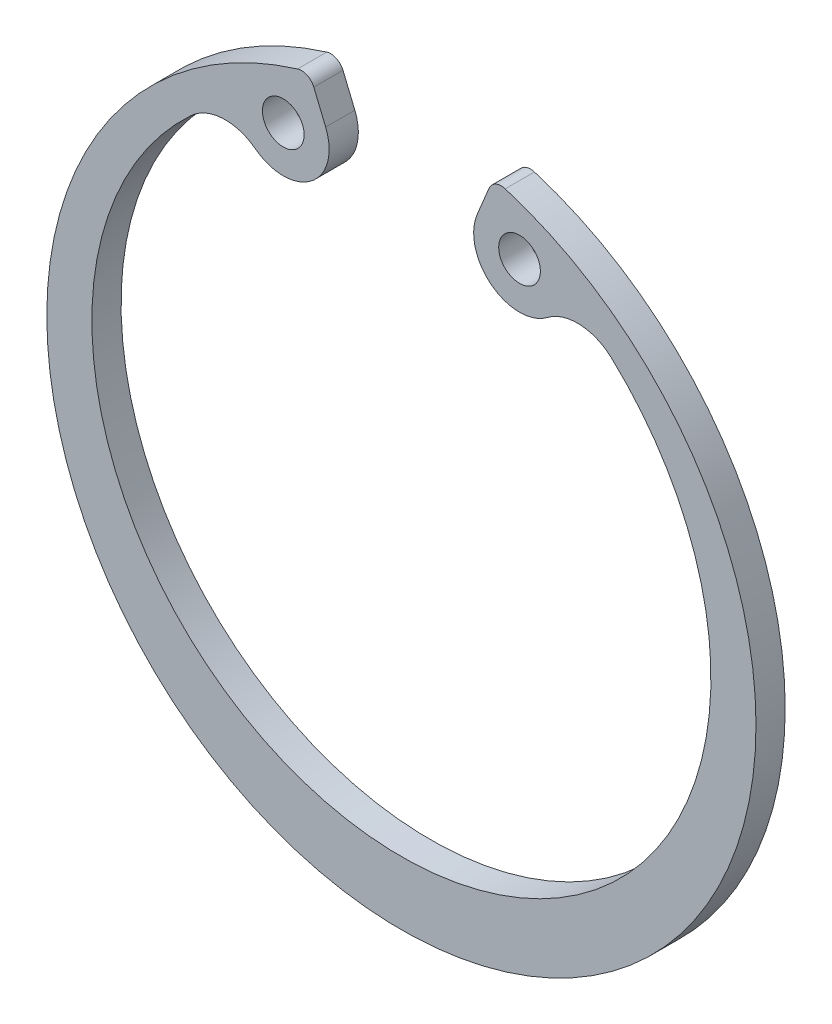
ISO-10303-21;
HEADER;
FILE_DESCRIPTION(('STEP AP214'),'2;1');
FILE_NAME('part.step','',(''),(''),'','','');
FILE_SCHEMA(('AUTOMOTIVE_DESIGN { 1 0 10303 214 1 1 1 1 }'));
ENDSEC;
DATA;
#1=APPLICATION_CONTEXT('core data for automotive mechanical design processes');
#2=APPLICATION_PROTOCOL_DEFINITION('international standard','automotive_design',2000,#1);
#3=PRODUCT_CONTEXT('',#1,'mechanical');
#4=PRODUCT('Part','Part','',(#3));
#5=PRODUCT_RELATED_PRODUCT_CATEGORY('part','',(#4));
#6=PRODUCT_DEFINITION_FORMATION('','',#4);
#7=PRODUCT_DEFINITION_CONTEXT('part definition',#1,'design');
#8=PRODUCT_DEFINITION('design','',#6,#7);
#9=PRODUCT_DEFINITION_SHAPE('','',#8);
#10=(LENGTH_UNIT() NAMED_UNIT(*) SI_UNIT(.MILLI.,.METRE.));
#11=(NAMED_UNIT(*) PLANE_ANGLE_UNIT() SI_UNIT($,.RADIAN.));
#12=(NAMED_UNIT(*) SI_UNIT($,.STERADIAN.) SOLID_ANGLE_UNIT());
#13=UNCERTAINTY_MEASURE_WITH_UNIT(LENGTH_MEASURE(1.E-05),#10,'distance_accuracy_value','');
#14=(GEOMETRIC_REPRESENTATION_CONTEXT(3) GLOBAL_UNCERTAINTY_ASSIGNED_CONTEXT((#13)) GLOBAL_UNIT_ASSIGNED_CONTEXT((#10,
#11,#12)) REPRESENTATION_CONTEXT('',''));
#15=CARTESIAN_POINT('',(0.,0.,0.));
#16=DIRECTION('',(0.,0.,1.));
#17=DIRECTION('',(1.,0.,0.));
#18=AXIS2_PLACEMENT_3D('',#15,#16,#17);
#19=CARTESIAN_POINT('',(-5.98848736185956,19.5535295820691,0.));
#20=DIRECTION('',(0.,0.,1.));
#21=DIRECTION('',(1.,0.,0.));
#22=AXIS2_PLACEMENT_3D('',#19,#20,#21);
#23=CYLINDRICAL_SURFACE('',#22,0.799999999999982);
#24=CARTESIAN_POINT('',(-5.98848736185956,19.5535295820691,1.75));
#25=DIRECTION('',(0.,0.,1.));
#26=DIRECTION('',(1.,0.,0.));
#27=AXIS2_PLACEMENT_3D('',#24,#25,#26);
#28=CIRCLE('',#27,0.799999999999982);
#29=CARTESIAN_POINT('',(-5.24938116554028,19.8596701226096,1.75));
#30=VERTEX_POINT('',#29);
#31=CARTESIAN_POINT('',(-6.22275581611323,20.3184598346683,1.75));
#32=VERTEX_POINT('',#31);
#33=EDGE_CURVE('E141',#30,#32,#28,.T.);
#34=ORIENTED_EDGE('',*,*,#33,.F.);
#35=DIRECTION('',(0.,0.,1.));
#36=VECTOR('',#35,1.);
#37=CARTESIAN_POINT('',(-5.24938116554028,19.8596701226096,0.));
#38=LINE('',#37,#36);
#39=CARTESIAN_POINT('',(-5.24938116554028,19.8596701226096,0.));
#40=VERTEX_POINT('',#39);
#41=EDGE_CURVE('E11',#40,#30,#38,.T.);
#42=ORIENTED_EDGE('',*,*,#41,.F.);
#43=CARTESIAN_POINT('',(-5.98848736185956,19.5535295820691,0.));
#44=DIRECTION('',(0.,0.,1.));
#45=DIRECTION('',(1.,0.,0.));
#46=AXIS2_PLACEMENT_3D('',#43,#44,#45);
#47=CIRCLE('',#46,0.799999999999982);
#48=CARTESIAN_POINT('',(-6.22275581611323,20.3184598346683,0.));
#49=VERTEX_POINT('',#48);
#50=EDGE_CURVE('E168',#40,#49,#47,.T.);
#51=ORIENTED_EDGE('',*,*,#50,.T.);
#52=DIRECTION('',(0.,0.,1.));
#53=VECTOR('',#52,1.);
#54=CARTESIAN_POINT('',(-6.22275581611323,20.3184598346683,0.));
#55=LINE('',#54,#53);
#56=EDGE_CURVE('E35',#49,#32,#55,.T.);
#57=ORIENTED_EDGE('',*,*,#56,.T.);
#58=EDGE_LOOP('',(#34,#42,#51,#57));
#59=FACE_BOUND('',#58,.T.);
#60=ADVANCED_FACE('F32',(#59),#23,.T.);
#61=CARTESIAN_POINT('',(-4.5388224501525,18.1441888979913,0.));
#62=DIRECTION('',(0.923882745399091,0.382675675675681,0.));
#63=DIRECTION('',(-0.382675675675681,0.923882745399091,0.));
#64=AXIS2_PLACEMENT_3D('',#61,#62,#63);
#65=PLANE('',#64);
#66=DIRECTION('',(-0.382675675675681,0.923882745399091,0.));
#67=VECTOR('',#66,1.);
#68=CARTESIAN_POINT('',(-4.5388224501525,18.1441888979913,1.75));
#69=LINE('',#68,#67);
#70=CARTESIAN_POINT('',(-4.53882245015251,18.1441888979913,1.75));
#71=VERTEX_POINT('',#70);
#72=EDGE_CURVE('E166',#71,#30,#69,.T.);
#73=ORIENTED_EDGE('',*,*,#72,.F.);
#74=DIRECTION('',(0.,0.,1.));
#75=VECTOR('',#74,1.);
#76=CARTESIAN_POINT('',(-4.53882245015251,18.1441888979913,0.));
#77=LINE('',#76,#75);
#78=CARTESIAN_POINT('',(-4.53882245015251,18.1441888979913,0.));
#79=VERTEX_POINT('',#78);
#80=EDGE_CURVE('E41',#79,#71,#77,.T.);
#81=ORIENTED_EDGE('',*,*,#80,.F.);
#82=DIRECTION('',(-0.382675675675681,0.923882745399091,0.));
#83=VECTOR('',#82,1.);
#84=CARTESIAN_POINT('',(-4.5388224501525,18.1441888979913,0.));
#85=LINE('',#84,#83);
#86=EDGE_CURVE('E131',#79,#40,#85,.T.);
#87=ORIENTED_EDGE('',*,*,#86,.T.);
#88=ORIENTED_EDGE('',*,*,#41,.T.);
#89=EDGE_LOOP('',(#73,#81,#87,#88));
#90=FACE_BOUND('',#89,.T.);
#91=ADVANCED_FACE('F184',(#90),#65,.T.);
#92=CARTESIAN_POINT('',(-7.0795,17.0918307898832,0.));
#93=DIRECTION('',(0.,0.,1.));
#94=DIRECTION('',(1.,0.,0.));
#95=AXIS2_PLACEMENT_3D('',#92,#93,#94);
#96=CYLINDRICAL_SURFACE('',#95,2.75);
#97=CARTESIAN_POINT('',(-7.0795,17.0918307898832,1.75));
#98=DIRECTION('',(0.,0.,1.));
#99=DIRECTION('',(1.,0.,0.));
#100=AXIS2_PLACEMENT_3D('',#97,#98,#99);
#101=CIRCLE('',#100,2.75);
#102=CARTESIAN_POINT('',(-8.7439597668217,14.9027502329754,1.75));
#103=VERTEX_POINT('',#102);
#104=EDGE_CURVE('E118',#103,#71,#101,.T.);
#105=ORIENTED_EDGE('',*,*,#104,.F.);
#106=DIRECTION('',(0.,0.,1.));
#107=VECTOR('',#106,1.);
#108=CARTESIAN_POINT('',(-8.7439597668217,14.9027502329754,0.));
#109=LINE('',#108,#107);
#110=CARTESIAN_POINT('',(-8.7439597668217,14.9027502329754,0.));
#111=VERTEX_POINT('',#110);
#112=EDGE_CURVE('E113',#111,#103,#109,.T.);
#113=ORIENTED_EDGE('',*,*,#112,.F.);
#114=CARTESIAN_POINT('',(-7.0795,17.0918307898832,0.));
#115=DIRECTION('',(0.,0.,1.));
#116=DIRECTION('',(1.,0.,0.));
#117=AXIS2_PLACEMENT_3D('',#114,#115,#116);
#118=CIRCLE('',#117,2.75);
#119=EDGE_CURVE('E116',#111,#79,#118,.T.);
#120=ORIENTED_EDGE('',*,*,#119,.T.);
#121=ORIENTED_EDGE('',*,*,#80,.T.);
#122=EDGE_LOOP('',(#105,#113,#120,#121));
#123=FACE_BOUND('',#122,.T.);
#124=ADVANCED_FACE('F115',(#123),#96,.T.);
#125=CARTESIAN_POINT('',(-10.5597340578999,12.5146623527123,0.));
#126=DIRECTION('',(0.,0.,1.));
#127=DIRECTION('',(1.,0.,0.));
#128=AXIS2_PLACEMENT_3D('',#125,#126,#127);
#129=CYLINDRICAL_SURFACE('',#128,2.99999999999999);
#130=CARTESIAN_POINT('',(-10.5597340578999,12.5146623527123,1.75));
#131=DIRECTION('',(0.,0.,-1.));
#132=DIRECTION('',(-1.,0.,0.));
#133=AXIS2_PLACEMENT_3D('',#130,#131,#132);
#134=CIRCLE('',#133,2.99999999999999);
#135=CARTESIAN_POINT('',(-12.5969817861121,14.716848015615,1.75));
#136=VERTEX_POINT('',#135);
#137=EDGE_CURVE('E163',#136,#103,#134,.T.);
#138=ORIENTED_EDGE('',*,*,#137,.F.);
#139=DIRECTION('',(0.,0.,1.));
#140=VECTOR('',#139,1.);
#141=CARTESIAN_POINT('',(-12.5969817861121,14.716848015615,0.));
#142=LINE('',#141,#140);
#143=CARTESIAN_POINT('',(-12.5969817861121,14.716848015615,0.));
#144=VERTEX_POINT('',#143);
#145=EDGE_CURVE('E123',#144,#136,#142,.T.);
#146=ORIENTED_EDGE('',*,*,#145,.F.);
#147=CARTESIAN_POINT('',(-10.5597340578999,12.5146623527123,0.));
#148=DIRECTION('',(0.,0.,-1.));
#149=DIRECTION('',(-1.,0.,0.));
#150=AXIS2_PLACEMENT_3D('',#147,#148,#149);
#151=CIRCLE('',#150,2.99999999999999);
#152=EDGE_CURVE('E129',#144,#111,#151,.T.);
#153=ORIENTED_EDGE('',*,*,#152,.T.);
#154=ORIENTED_EDGE('',*,*,#112,.T.);
#155=EDGE_LOOP('',(#138,#146,#153,#154));
#156=FACE_BOUND('',#155,.T.);
#157=ADVANCED_FACE('F133',(#156),#129,.F.);
#158=CARTESIAN_POINT('',(0.,1.1,0.));
#159=DIRECTION('',(0.,0.,1.));
#160=DIRECTION('',(1.,0.,0.));
#161=AXIS2_PLACEMENT_3D('',#158,#159,#160);
#162=CYLINDRICAL_SURFACE('',#161,18.55);
#163=CARTESIAN_POINT('',(0.,1.1,1.75));
#164=DIRECTION('',(0.,0.,-1.));
#165=DIRECTION('',(-1.,0.,0.));
#166=AXIS2_PLACEMENT_3D('',#163,#164,#165);
#167=CIRCLE('',#166,18.55);
#168=CARTESIAN_POINT('',(12.5969817861121,14.716848015615,1.75));
#169=VERTEX_POINT('',#168);
#170=EDGE_CURVE('E160',#169,#136,#167,.T.);
#171=ORIENTED_EDGE('',*,*,#170,.F.);
#172=DIRECTION('',(0.,0.,1.));
#173=VECTOR('',#172,1.);
#174=CARTESIAN_POINT('',(12.5969817861121,14.716848015615,0.));
#175=LINE('',#174,#173);
#176=CARTESIAN_POINT('',(12.5969817861121,14.716848015615,0.));
#177=VERTEX_POINT('',#176);
#178=EDGE_CURVE('E172',#177,#169,#175,.T.);
#179=ORIENTED_EDGE('',*,*,#178,.F.);
#180=CARTESIAN_POINT('',(0.,1.1,0.));
#181=DIRECTION('',(0.,0.,-1.));
#182=DIRECTION('',(-1.,0.,0.));
#183=AXIS2_PLACEMENT_3D('',#180,#181,#182);
#184=CIRCLE('',#183,18.55);
#185=EDGE_CURVE('E134',#177,#144,#184,.T.);
#186=ORIENTED_EDGE('',*,*,#185,.T.);
#187=ORIENTED_EDGE('',*,*,#145,.T.);
#188=EDGE_LOOP('',(#171,#179,#186,#187));
#189=FACE_BOUND('',#188,.T.);
#190=ADVANCED_FACE('F197',(#189),#162,.F.);
#191=CARTESIAN_POINT('',(10.5597340578999,12.5146623527123,0.));
#192=DIRECTION('',(0.,0.,1.));
#193=DIRECTION('',(1.,0.,0.));
#194=AXIS2_PLACEMENT_3D('',#191,#192,#193);
#195=CYLINDRICAL_SURFACE('',#194,2.99999999999999);
#196=CARTESIAN_POINT('',(10.5597340578999,12.5146623527123,1.75));
#197=DIRECTION('',(0.,0.,-1.));
#198=DIRECTION('',(-1.,0.,0.));
#199=AXIS2_PLACEMENT_3D('',#196,#197,#198);
#200=CIRCLE('',#199,2.99999999999999);
#201=CARTESIAN_POINT('',(8.74395976682171,14.9027502329754,1.75));
#202=VERTEX_POINT('',#201);
#203=EDGE_CURVE('E157',#202,#169,#200,.T.);
#204=ORIENTED_EDGE('',*,*,#203,.F.);
#205=DIRECTION('',(0.,0.,1.));
#206=VECTOR('',#205,1.);
#207=CARTESIAN_POINT('',(8.74395976682171,14.9027502329754,0.));
#208=LINE('',#207,#206);
#209=CARTESIAN_POINT('',(8.74395976682171,14.9027502329754,0.));
#210=VERTEX_POINT('',#209);
#211=EDGE_CURVE('E174',#210,#202,#208,.T.);
#212=ORIENTED_EDGE('',*,*,#211,.F.);
#213=CARTESIAN_POINT('',(10.5597340578999,12.5146623527123,0.));
#214=DIRECTION('',(0.,0.,-1.));
#215=DIRECTION('',(-1.,0.,0.));
#216=AXIS2_PLACEMENT_3D('',#213,#214,#215);
#217=CIRCLE('',#216,2.99999999999999);
#218=EDGE_CURVE('E136',#210,#177,#217,.T.);
#219=ORIENTED_EDGE('',*,*,#218,.T.);
#220=ORIENTED_EDGE('',*,*,#178,.T.);
#221=EDGE_LOOP('',(#204,#212,#219,#220));
#222=FACE_BOUND('',#221,.T.);
#223=ADVANCED_FACE('F200',(#222),#195,.F.);
#224=CARTESIAN_POINT('',(7.0795,17.0918307898832,0.));
#225=DIRECTION('',(0.,0.,1.));
#226=DIRECTION('',(1.,0.,0.));
#227=AXIS2_PLACEMENT_3D('',#224,#225,#226);
#228=CYLINDRICAL_SURFACE('',#227,2.75);
#229=CARTESIAN_POINT('',(7.0795,17.0918307898832,1.75));
#230=DIRECTION('',(0.,0.,1.));
#231=DIRECTION('',(1.,0.,0.));
#232=AXIS2_PLACEMENT_3D('',#229,#230,#231);
#233=CIRCLE('',#232,2.75);
#234=CARTESIAN_POINT('',(4.5388224501525,18.1441888979913,1.75));
#235=VERTEX_POINT('',#234);
#236=EDGE_CURVE('E154',#235,#202,#233,.T.);
#237=ORIENTED_EDGE('',*,*,#236,.F.);
#238=DIRECTION('',(0.,0.,1.));
#239=VECTOR('',#238,1.);
#240=CARTESIAN_POINT('',(4.5388224501525,18.1441888979913,0.));
#241=LINE('',#240,#239);
#242=CARTESIAN_POINT('',(4.5388224501525,18.1441888979913,0.));
#243=VERTEX_POINT('',#242);
#244=EDGE_CURVE('E176',#243,#235,#241,.T.);
#245=ORIENTED_EDGE('',*,*,#244,.F.);
#246=CARTESIAN_POINT('',(7.0795,17.0918307898832,0.));
#247=DIRECTION('',(0.,0.,1.));
#248=DIRECTION('',(1.,0.,0.));
#249=AXIS2_PLACEMENT_3D('',#246,#247,#248);
#250=CIRCLE('',#249,2.75);
#251=EDGE_CURVE('E260',#243,#210,#250,.T.);
#252=ORIENTED_EDGE('',*,*,#251,.T.);
#253=ORIENTED_EDGE('',*,*,#211,.T.);
#254=EDGE_LOOP('',(#237,#245,#252,#253));
#255=FACE_BOUND('',#254,.T.);
#256=ADVANCED_FACE('F204',(#255),#228,.T.);
#257=CARTESIAN_POINT('',(5.24938116554028,19.8596701226096,0.));
#258=DIRECTION('',(-0.923882745399091,0.382675675675681,0.));
#259=DIRECTION('',(-0.382675675675681,-0.923882745399091,0.));
#260=AXIS2_PLACEMENT_3D('',#257,#258,#259);
#261=PLANE('',#260);
#262=DIRECTION('',(-0.382675675675681,-0.923882745399091,0.));
#263=VECTOR('',#262,1.);
#264=CARTESIAN_POINT('',(5.24938116554028,19.8596701226096,1.75));
#265=LINE('',#264,#263);
#266=CARTESIAN_POINT('',(5.24938116554029,19.8596701226095,1.75));
#267=VERTEX_POINT('',#266);
#268=EDGE_CURVE('E151',#267,#235,#265,.T.);
#269=ORIENTED_EDGE('',*,*,#268,.F.);
#270=DIRECTION('',(0.,0.,1.));
#271=VECTOR('',#270,1.);
#272=CARTESIAN_POINT('',(5.24938116554029,19.8596701226095,0.));
#273=LINE('',#272,#271);
#274=CARTESIAN_POINT('',(5.24938116554029,19.8596701226095,0.));
#275=VERTEX_POINT('',#274);
#276=EDGE_CURVE('E178',#275,#267,#273,.T.);
#277=ORIENTED_EDGE('',*,*,#276,.F.);
#278=DIRECTION('',(-0.382675675675681,-0.923882745399091,0.));
#279=VECTOR('',#278,1.);
#280=CARTESIAN_POINT('',(5.24938116554028,19.8596701226096,0.));
#281=LINE('',#280,#279);
#282=EDGE_CURVE('E257',#275,#243,#281,.T.);
#283=ORIENTED_EDGE('',*,*,#282,.T.);
#284=ORIENTED_EDGE('',*,*,#244,.T.);
#285=EDGE_LOOP('',(#269,#277,#283,#284));
#286=FACE_BOUND('',#285,.T.);
#287=ADVANCED_FACE('F208',(#286),#261,.T.);
#288=CARTESIAN_POINT('',(5.98848736185956,19.5535295820691,0.));
#289=DIRECTION('',(0.,0.,1.));
#290=DIRECTION('',(1.,0.,0.));
#291=AXIS2_PLACEMENT_3D('',#288,#289,#290);
#292=CYLINDRICAL_SURFACE('',#291,0.799999999999982);
#293=CARTESIAN_POINT('',(5.98848736185956,19.5535295820691,1.75));
#294=DIRECTION('',(0.,0.,1.));
#295=DIRECTION('',(1.,0.,0.));
#296=AXIS2_PLACEMENT_3D('',#293,#294,#295);
#297=CIRCLE('',#296,0.799999999999982);
#298=CARTESIAN_POINT('',(6.22275581611323,20.3184598346683,1.75));
#299=VERTEX_POINT('',#298);
#300=EDGE_CURVE('E148',#299,#267,#297,.T.);
#301=ORIENTED_EDGE('',*,*,#300,.F.);
#302=DIRECTION('',(0.,0.,1.));
#303=VECTOR('',#302,1.);
#304=CARTESIAN_POINT('',(6.22275581611323,20.3184598346683,0.));
#305=LINE('',#304,#303);
#306=CARTESIAN_POINT('',(6.22275581611323,20.3184598346683,0.));
#307=VERTEX_POINT('',#306);
#308=EDGE_CURVE('E179',#307,#299,#305,.T.);
#309=ORIENTED_EDGE('',*,*,#308,.F.);
#310=CARTESIAN_POINT('',(5.98848736185956,19.5535295820691,0.));
#311=DIRECTION('',(0.,0.,1.));
#312=DIRECTION('',(1.,0.,0.));
#313=AXIS2_PLACEMENT_3D('',#310,#311,#312);
#314=CIRCLE('',#313,0.799999999999982);
#315=EDGE_CURVE('E254',#307,#275,#314,.T.);
#316=ORIENTED_EDGE('',*,*,#315,.T.);
#317=ORIENTED_EDGE('',*,*,#276,.T.);
#318=EDGE_LOOP('',(#301,#309,#316,#317));
#319=FACE_BOUND('',#318,.T.);
#320=ADVANCED_FACE('F212',(#319),#292,.T.);
#321=CARTESIAN_POINT('',(0.,0.,0.));
#322=DIRECTION('',(0.,0.,1.));
#323=DIRECTION('',(1.,0.,0.));
#324=AXIS2_PLACEMENT_3D('',#321,#322,#323);
#325=CYLINDRICAL_SURFACE('',#324,21.25);
#326=CARTESIAN_POINT('',(0.,0.,1.75));
#327=DIRECTION('',(0.,0.,1.));
#328=DIRECTION('',(1.,0.,0.));
#329=AXIS2_PLACEMENT_3D('',#326,#327,#328);
#330=CIRCLE('',#329,21.25);
#331=EDGE_CURVE('E144',#32,#299,#330,.T.);
#332=ORIENTED_EDGE('',*,*,#331,.F.);
#333=ORIENTED_EDGE('',*,*,#56,.F.);
#334=CARTESIAN_POINT('',(0.,0.,0.));
#335=DIRECTION('',(0.,0.,1.));
#336=DIRECTION('',(1.,0.,0.));
#337=AXIS2_PLACEMENT_3D('',#334,#335,#336);
#338=CIRCLE('',#337,21.25);
#339=EDGE_CURVE('E252',#49,#307,#338,.T.);
#340=ORIENTED_EDGE('',*,*,#339,.T.);
#341=ORIENTED_EDGE('',*,*,#308,.T.);
#342=EDGE_LOOP('',(#332,#333,#340,#341));
#343=FACE_BOUND('',#342,.T.);
#344=ADVANCED_FACE('F181',(#343),#325,.T.);
#345=CARTESIAN_POINT('',(-5.98848736185956,19.5535295820691,0.));
#346=DIRECTION('',(0.,0.,1.));
#347=DIRECTION('',(1.,0.,0.));
#348=AXIS2_PLACEMENT_3D('',#345,#346,#347);
#349=PLANE('',#348);
#350=CARTESIAN_POINT('',(7.0795,17.0918307898832,0.));
#351=DIRECTION('',(0.,0.,1.));
#352=DIRECTION('',(-1.,0.,0.));
#353=AXIS2_PLACEMENT_3D('',#350,#351,#352);
#354=CIRCLE('',#353,1.25);
#355=CARTESIAN_POINT('',(5.8295,17.0918307898832,0.));
#356=VERTEX_POINT('',#355);
#357=EDGE_CURVE('E239',#356,#356,#354,.T.);
#358=ORIENTED_EDGE('',*,*,#357,.T.);
#359=EDGE_LOOP('',(#358));
#360=FACE_BOUND('',#359,.T.);
#361=CARTESIAN_POINT('',(-7.0795,17.0918307898832,0.));
#362=DIRECTION('',(0.,0.,1.));
#363=DIRECTION('',(-1.,0.,0.));
#364=AXIS2_PLACEMENT_3D('',#361,#362,#363);
#365=CIRCLE('',#364,1.25);
#366=CARTESIAN_POINT('',(-8.3295,17.0918307898832,0.));
#367=VERTEX_POINT('',#366);
#368=EDGE_CURVE('E145',#367,#367,#365,.T.);
#369=ORIENTED_EDGE('',*,*,#368,.T.);
#370=EDGE_LOOP('',(#369));
#371=FACE_BOUND('',#370,.T.);
#372=ORIENTED_EDGE('',*,*,#50,.F.);
#373=ORIENTED_EDGE('',*,*,#86,.F.);
#374=ORIENTED_EDGE('',*,*,#119,.F.);
#375=ORIENTED_EDGE('',*,*,#152,.F.);
#376=ORIENTED_EDGE('',*,*,#185,.F.);
#377=ORIENTED_EDGE('',*,*,#218,.F.);
#378=ORIENTED_EDGE('',*,*,#251,.F.);
#379=ORIENTED_EDGE('',*,*,#282,.F.);
#380=ORIENTED_EDGE('',*,*,#315,.F.);
#381=ORIENTED_EDGE('',*,*,#339,.F.);
#382=EDGE_LOOP('',(#372,#373,#374,#375,#376,#377,#378,#379,#380,#381));
#383=FACE_BOUND('',#382,.T.);
#384=ADVANCED_FACE('F127',(#360,#371,#383),#349,.F.);
#385=CARTESIAN_POINT('',(-5.98848736185956,19.5535295820691,1.75));
#386=DIRECTION('',(0.,0.,1.));
#387=DIRECTION('',(1.,0.,0.));
#388=AXIS2_PLACEMENT_3D('',#385,#386,#387);
#389=PLANE('',#388);
#390=CARTESIAN_POINT('',(7.0795,17.0918307898832,1.75));
#391=DIRECTION('',(0.,0.,1.));
#392=DIRECTION('',(-1.,0.,0.));
#393=AXIS2_PLACEMENT_3D('',#390,#391,#392);
#394=CIRCLE('',#393,1.25);
#395=CARTESIAN_POINT('',(5.8295,17.0918307898832,1.75));
#396=VERTEX_POINT('',#395);
#397=EDGE_CURVE('E242',#396,#396,#394,.T.);
#398=ORIENTED_EDGE('',*,*,#397,.F.);
#399=EDGE_LOOP('',(#398));
#400=FACE_BOUND('',#399,.T.);
#401=CARTESIAN_POINT('',(-7.0795,17.0918307898832,1.75));
#402=DIRECTION('',(0.,0.,1.));
#403=DIRECTION('',(-1.,0.,0.));
#404=AXIS2_PLACEMENT_3D('',#401,#402,#403);
#405=CIRCLE('',#404,1.25);
#406=CARTESIAN_POINT('',(-8.3295,17.0918307898832,1.75));
#407=VERTEX_POINT('',#406);
#408=EDGE_CURVE('E244',#407,#407,#405,.T.);
#409=ORIENTED_EDGE('',*,*,#408,.F.);
#410=EDGE_LOOP('',(#409));
#411=FACE_BOUND('',#410,.T.);
#412=ORIENTED_EDGE('',*,*,#33,.T.);
#413=ORIENTED_EDGE('',*,*,#331,.T.);
#414=ORIENTED_EDGE('',*,*,#300,.T.);
#415=ORIENTED_EDGE('',*,*,#268,.T.);
#416=ORIENTED_EDGE('',*,*,#236,.T.);
#417=ORIENTED_EDGE('',*,*,#203,.T.);
#418=ORIENTED_EDGE('',*,*,#170,.T.);
#419=ORIENTED_EDGE('',*,*,#137,.T.);
#420=ORIENTED_EDGE('',*,*,#104,.T.);
#421=ORIENTED_EDGE('',*,*,#72,.T.);
#422=EDGE_LOOP('',(#412,#413,#414,#415,#416,#417,#418,#419,#420,#421));
#423=FACE_BOUND('',#422,.T.);
#424=ADVANCED_FACE('F183',(#400,#411,#423),#389,.T.);
#425=CARTESIAN_POINT('',(-7.0795,17.0918307898832,0.));
#426=DIRECTION('',(0.,0.,1.));
#427=DIRECTION('',(1.,0.,0.));
#428=AXIS2_PLACEMENT_3D('',#425,#426,#427);
#429=CYLINDRICAL_SURFACE('',#428,1.25);
#430=ORIENTED_EDGE('',*,*,#368,.F.);
#431=EDGE_LOOP('',(#430));
#432=FACE_BOUND('',#431,.T.);
#433=ORIENTED_EDGE('',*,*,#408,.T.);
#434=EDGE_LOOP('',(#433));
#435=FACE_BOUND('',#434,.T.);
#436=ADVANCED_FACE('F224',(#432,#435),#429,.F.);
#437=CARTESIAN_POINT('',(7.0795,17.0918307898832,0.));
#438=DIRECTION('',(0.,0.,1.));
#439=DIRECTION('',(1.,0.,0.));
#440=AXIS2_PLACEMENT_3D('',#437,#438,#439);
#441=CYLINDRICAL_SURFACE('',#440,1.25);
#442=ORIENTED_EDGE('',*,*,#357,.F.);
#443=EDGE_LOOP('',(#442));
#444=FACE_BOUND('',#443,.T.);
#445=ORIENTED_EDGE('',*,*,#397,.T.);
#446=EDGE_LOOP('',(#445));
#447=FACE_BOUND('',#446,.T.);
#448=ADVANCED_FACE('F231',(#444,#447),#441,.F.);
#449=CLOSED_SHELL('',(#60,#91,#124,#157,#190,#223,#256,#287,#320,#344,#384,#424,#436,#448));
#450=MANIFOLD_SOLID_BREP('B2',#449);
#451=ADVANCED_BREP_SHAPE_REPRESENTATION('',(#18,#450),#14);
#452=SHAPE_DEFINITION_REPRESENTATION(#9,#451);
ENDSEC;
END-ISO-10303-21;
